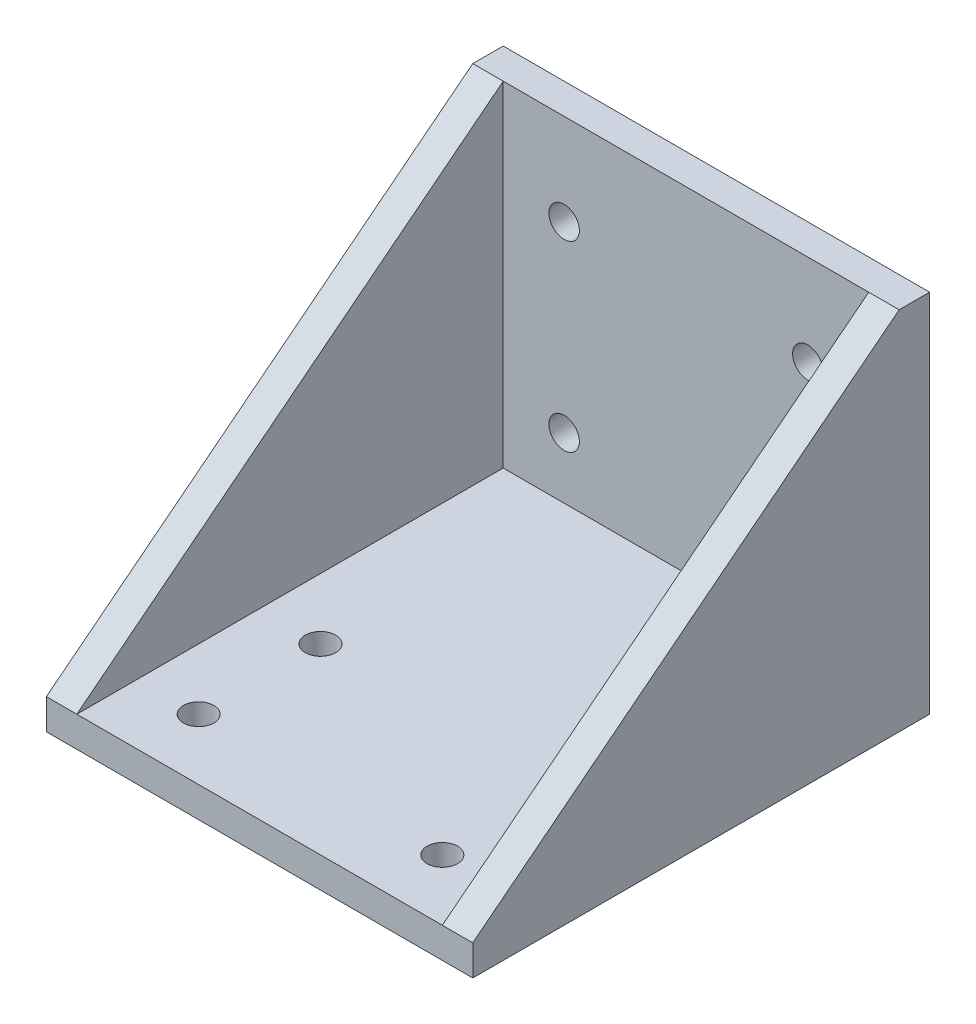
ISO-10303-21;
HEADER;
FILE_DESCRIPTION(('STEP AP214'),'2;1');
FILE_NAME('part.step','',(''),(''),'','','');
FILE_SCHEMA(('AUTOMOTIVE_DESIGN { 1 0 10303 214 1 1 1 1 }'));
ENDSEC;
DATA;
#1=APPLICATION_CONTEXT('core data for automotive mechanical design processes');
#2=APPLICATION_PROTOCOL_DEFINITION('international standard','automotive_design',2000,#1);
#3=PRODUCT_CONTEXT('',#1,'mechanical');
#4=PRODUCT('Part','Part','',(#3));
#5=PRODUCT_RELATED_PRODUCT_CATEGORY('part','',(#4));
#6=PRODUCT_DEFINITION_FORMATION('','',#4);
#7=PRODUCT_DEFINITION_CONTEXT('part definition',#1,'design');
#8=PRODUCT_DEFINITION('design','',#6,#7);
#9=PRODUCT_DEFINITION_SHAPE('','',#8);
#10=(LENGTH_UNIT() NAMED_UNIT(*) SI_UNIT(.MILLI.,.METRE.));
#11=(NAMED_UNIT(*) PLANE_ANGLE_UNIT() SI_UNIT($,.RADIAN.));
#12=(NAMED_UNIT(*) SI_UNIT($,.STERADIAN.) SOLID_ANGLE_UNIT());
#13=UNCERTAINTY_MEASURE_WITH_UNIT(LENGTH_MEASURE(1.E-05),#10,'distance_accuracy_value','');
#14=(GEOMETRIC_REPRESENTATION_CONTEXT(3) GLOBAL_UNCERTAINTY_ASSIGNED_CONTEXT((#13)) GLOBAL_UNIT_ASSIGNED_CONTEXT((#10,
#11,#12)) REPRESENTATION_CONTEXT('',''));
#15=CARTESIAN_POINT('',(0.,0.,0.));
#16=DIRECTION('',(0.,0.,1.));
#17=DIRECTION('',(1.,0.,0.));
#18=AXIS2_PLACEMENT_3D('',#15,#16,#17);
#19=CARTESIAN_POINT('',(0.,0.,5.));
#20=DIRECTION('',(0.,0.,-1.));
#21=DIRECTION('',(-1.,0.,0.));
#22=AXIS2_PLACEMENT_3D('',#19,#20,#21);
#23=PLANE('',#22);
#24=DIRECTION('',(-1.,0.,0.));
#25=VECTOR('',#24,1.);
#26=CARTESIAN_POINT('',(-35.,30.,5.));
#27=LINE('',#26,#25);
#28=CARTESIAN_POINT('',(30.,30.,5.));
#29=VERTEX_POINT('',#28);
#30=CARTESIAN_POINT('',(-30.,30.,5.));
#31=VERTEX_POINT('',#30);
#32=EDGE_CURVE('E126',#29,#31,#27,.T.);
#33=ORIENTED_EDGE('',*,*,#32,.T.);
#34=DIRECTION('',(0.,-1.,0.));
#35=VECTOR('',#34,1.);
#36=CARTESIAN_POINT('',(-30.,0.,5.));
#37=LINE('',#36,#35);
#38=CARTESIAN_POINT('',(-30.,-25.,5.));
#39=VERTEX_POINT('',#38);
#40=EDGE_CURVE('E64',#31,#39,#37,.T.);
#41=ORIENTED_EDGE('',*,*,#40,.T.);
#42=DIRECTION('',(1.,0.,0.));
#43=VECTOR('',#42,1.);
#44=CARTESIAN_POINT('',(0.,-25.,5.));
#45=LINE('',#44,#43);
#46=CARTESIAN_POINT('',(30.,-25.,5.));
#47=VERTEX_POINT('',#46);
#48=EDGE_CURVE('E180',#39,#47,#45,.T.);
#49=ORIENTED_EDGE('',*,*,#48,.T.);
#50=DIRECTION('',(0.,-1.,0.));
#51=VECTOR('',#50,1.);
#52=CARTESIAN_POINT('',(30.,0.,5.));
#53=LINE('',#52,#51);
#54=EDGE_CURVE('E182',#29,#47,#53,.T.);
#55=ORIENTED_EDGE('',*,*,#54,.F.);
#56=EDGE_LOOP('',(#33,#41,#49,#55));
#57=FACE_BOUND('',#56,.T.);
#58=CARTESIAN_POINT('',(-20.,15.,5.));
#59=DIRECTION('',(0.,0.,1.));
#60=DIRECTION('',(1.,0.,0.));
#61=AXIS2_PLACEMENT_3D('',#58,#59,#60);
#62=CIRCLE('',#61,2.5);
#63=CARTESIAN_POINT('',(-17.5,15.,5.));
#64=VERTEX_POINT('',#63);
#65=EDGE_CURVE('E147',#64,#64,#62,.T.);
#66=ORIENTED_EDGE('',*,*,#65,.F.);
#67=EDGE_LOOP('',(#66));
#68=FACE_BOUND('',#67,.T.);
#69=CARTESIAN_POINT('',(20.,15.,5.));
#70=DIRECTION('',(0.,0.,1.));
#71=DIRECTION('',(1.,0.,0.));
#72=AXIS2_PLACEMENT_3D('',#69,#70,#71);
#73=CIRCLE('',#72,2.5);
#74=CARTESIAN_POINT('',(22.5,15.,5.));
#75=VERTEX_POINT('',#74);
#76=EDGE_CURVE('E152',#75,#75,#73,.T.);
#77=ORIENTED_EDGE('',*,*,#76,.F.);
#78=EDGE_LOOP('',(#77));
#79=FACE_BOUND('',#78,.T.);
#80=CARTESIAN_POINT('',(-20.,-15.,5.));
#81=DIRECTION('',(0.,0.,1.));
#82=DIRECTION('',(1.,0.,0.));
#83=AXIS2_PLACEMENT_3D('',#80,#81,#82);
#84=CIRCLE('',#83,2.5);
#85=CARTESIAN_POINT('',(-17.5,-15.,5.));
#86=VERTEX_POINT('',#85);
#87=EDGE_CURVE('E158',#86,#86,#84,.T.);
#88=ORIENTED_EDGE('',*,*,#87,.F.);
#89=EDGE_LOOP('',(#88));
#90=FACE_BOUND('',#89,.T.);
#91=CARTESIAN_POINT('',(20.,-15.,5.));
#92=DIRECTION('',(0.,0.,1.));
#93=DIRECTION('',(1.,0.,0.));
#94=AXIS2_PLACEMENT_3D('',#91,#92,#93);
#95=CIRCLE('',#94,2.5);
#96=CARTESIAN_POINT('',(22.5,-15.,5.));
#97=VERTEX_POINT('',#96);
#98=EDGE_CURVE('E164',#97,#97,#95,.T.);
#99=ORIENTED_EDGE('',*,*,#98,.F.);
#100=EDGE_LOOP('',(#99));
#101=FACE_BOUND('',#100,.T.);
#102=ADVANCED_FACE('F42',(#57,#68,#79,#90,#101),#23,.F.);
#103=CARTESIAN_POINT('',(0.,0.,0.));
#104=DIRECTION('',(0.,0.,-1.));
#105=DIRECTION('',(-1.,0.,0.));
#106=AXIS2_PLACEMENT_3D('',#103,#104,#105);
#107=PLANE('',#106);
#108=CARTESIAN_POINT('',(-20.,-15.,0.));
#109=DIRECTION('',(0.,0.,1.));
#110=DIRECTION('',(1.,0.,0.));
#111=AXIS2_PLACEMENT_3D('',#108,#109,#110);
#112=CIRCLE('',#111,2.5);
#113=CARTESIAN_POINT('',(-17.5,-15.,0.));
#114=VERTEX_POINT('',#113);
#115=EDGE_CURVE('E161',#114,#114,#112,.T.);
#116=ORIENTED_EDGE('',*,*,#115,.T.);
#117=EDGE_LOOP('',(#116));
#118=FACE_BOUND('',#117,.T.);
#119=CARTESIAN_POINT('',(-20.,15.,0.));
#120=DIRECTION('',(0.,0.,1.));
#121=DIRECTION('',(1.,0.,0.));
#122=AXIS2_PLACEMENT_3D('',#119,#120,#121);
#123=CIRCLE('',#122,2.5);
#124=CARTESIAN_POINT('',(-17.5,15.,0.));
#125=VERTEX_POINT('',#124);
#126=EDGE_CURVE('E149',#125,#125,#123,.T.);
#127=ORIENTED_EDGE('',*,*,#126,.T.);
#128=EDGE_LOOP('',(#127));
#129=FACE_BOUND('',#128,.T.);
#130=DIRECTION('',(0.,1.,0.));
#131=VECTOR('',#130,1.);
#132=CARTESIAN_POINT('',(35.,-30.,0.));
#133=LINE('',#132,#131);
#134=CARTESIAN_POINT('',(35.,-30.,0.));
#135=VERTEX_POINT('',#134);
#136=CARTESIAN_POINT('',(35.,30.,0.));
#137=VERTEX_POINT('',#136);
#138=EDGE_CURVE('E131',#135,#137,#133,.T.);
#139=ORIENTED_EDGE('',*,*,#138,.F.);
#140=DIRECTION('',(1.,0.,0.));
#141=VECTOR('',#140,1.);
#142=CARTESIAN_POINT('',(-35.,-30.,0.));
#143=LINE('',#142,#141);
#144=CARTESIAN_POINT('',(-35.,-30.,0.));
#145=VERTEX_POINT('',#144);
#146=EDGE_CURVE('E140',#145,#135,#143,.T.);
#147=ORIENTED_EDGE('',*,*,#146,.F.);
#148=DIRECTION('',(0.,-1.,0.));
#149=VECTOR('',#148,1.);
#150=CARTESIAN_POINT('',(-35.,-30.,0.));
#151=LINE('',#150,#149);
#152=CARTESIAN_POINT('',(-35.,30.,0.));
#153=VERTEX_POINT('',#152);
#154=EDGE_CURVE('E142',#153,#145,#151,.T.);
#155=ORIENTED_EDGE('',*,*,#154,.F.);
#156=DIRECTION('',(-1.,0.,0.));
#157=VECTOR('',#156,1.);
#158=CARTESIAN_POINT('',(-35.,30.,0.));
#159=LINE('',#158,#157);
#160=EDGE_CURVE('E144',#137,#153,#159,.T.);
#161=ORIENTED_EDGE('',*,*,#160,.F.);
#162=EDGE_LOOP('',(#139,#147,#155,#161));
#163=FACE_BOUND('',#162,.T.);
#164=CARTESIAN_POINT('',(20.,15.,0.));
#165=DIRECTION('',(0.,0.,1.));
#166=DIRECTION('',(1.,0.,0.));
#167=AXIS2_PLACEMENT_3D('',#164,#165,#166);
#168=CIRCLE('',#167,2.5);
#169=CARTESIAN_POINT('',(22.5,15.,0.));
#170=VERTEX_POINT('',#169);
#171=EDGE_CURVE('E155',#170,#170,#168,.T.);
#172=ORIENTED_EDGE('',*,*,#171,.T.);
#173=EDGE_LOOP('',(#172));
#174=FACE_BOUND('',#173,.T.);
#175=CARTESIAN_POINT('',(20.,-15.,0.));
#176=DIRECTION('',(0.,0.,1.));
#177=DIRECTION('',(1.,0.,0.));
#178=AXIS2_PLACEMENT_3D('',#175,#176,#177);
#179=CIRCLE('',#178,2.5);
#180=CARTESIAN_POINT('',(22.5,-15.,0.));
#181=VERTEX_POINT('',#180);
#182=EDGE_CURVE('E167',#181,#181,#179,.T.);
#183=ORIENTED_EDGE('',*,*,#182,.T.);
#184=EDGE_LOOP('',(#183));
#185=FACE_BOUND('',#184,.T.);
#186=ADVANCED_FACE('F249',(#118,#129,#163,#174,#185),#107,.T.);
#187=CARTESIAN_POINT('',(35.,-30.,5.));
#188=DIRECTION('',(-1.,0.,0.));
#189=DIRECTION('',(0.,0.,1.));
#190=AXIS2_PLACEMENT_3D('',#187,#188,#189);
#191=PLANE('',#190);
#192=DIRECTION('',(0.,0.,-1.));
#193=VECTOR('',#192,1.);
#194=CARTESIAN_POINT('',(35.,30.,5.));
#195=LINE('',#194,#193);
#196=CARTESIAN_POINT('',(35.,30.,5.));
#197=VERTEX_POINT('',#196);
#198=EDGE_CURVE('E50',#197,#137,#195,.T.);
#199=ORIENTED_EDGE('',*,*,#198,.F.);
#200=DIRECTION('',(0.,-0.617821551931903,0.786318338822423));
#201=VECTOR('',#200,1.);
#202=CARTESIAN_POINT('',(35.,30.,5.));
#203=LINE('',#202,#201);
#204=CARTESIAN_POINT('',(35.,-25.,75.));
#205=VERTEX_POINT('',#204);
#206=EDGE_CURVE('E106',#197,#205,#203,.T.);
#207=ORIENTED_EDGE('',*,*,#206,.T.);
#208=DIRECTION('',(0.,1.,0.));
#209=VECTOR('',#208,1.);
#210=CARTESIAN_POINT('',(35.,0.,75.));
#211=LINE('',#210,#209);
#212=CARTESIAN_POINT('',(35.,-30.,75.));
#213=VERTEX_POINT('',#212);
#214=EDGE_CURVE('E177',#213,#205,#211,.T.);
#215=ORIENTED_EDGE('',*,*,#214,.F.);
#216=DIRECTION('',(0.,0.,-1.));
#217=VECTOR('',#216,1.);
#218=CARTESIAN_POINT('',(35.,-30.,5.));
#219=LINE('',#218,#217);
#220=EDGE_CURVE('E138',#213,#135,#219,.T.);
#221=ORIENTED_EDGE('',*,*,#220,.T.);
#222=ORIENTED_EDGE('',*,*,#138,.T.);
#223=EDGE_LOOP('',(#199,#207,#215,#221,#222));
#224=FACE_BOUND('',#223,.T.);
#225=ADVANCED_FACE('F44',(#224),#191,.F.);
#226=CARTESIAN_POINT('',(-35.,30.,5.));
#227=DIRECTION('',(0.,-1.,0.));
#228=DIRECTION('',(0.,0.,-1.));
#229=AXIS2_PLACEMENT_3D('',#226,#227,#228);
#230=PLANE('',#229);
#231=DIRECTION('',(0.,0.,-1.));
#232=VECTOR('',#231,1.);
#233=CARTESIAN_POINT('',(-35.,30.,5.));
#234=LINE('',#233,#232);
#235=CARTESIAN_POINT('',(-35.,30.,5.));
#236=VERTEX_POINT('',#235);
#237=EDGE_CURVE('E132',#236,#153,#234,.T.);
#238=ORIENTED_EDGE('',*,*,#237,.F.);
#239=DIRECTION('',(-1.,0.,0.));
#240=VECTOR('',#239,1.);
#241=CARTESIAN_POINT('',(35.,30.,5.));
#242=LINE('',#241,#240);
#243=EDGE_CURVE('E117',#31,#236,#242,.T.);
#244=ORIENTED_EDGE('',*,*,#243,.F.);
#245=ORIENTED_EDGE('',*,*,#32,.F.);
#246=EDGE_CURVE('E109',#197,#29,#242,.T.);
#247=ORIENTED_EDGE('',*,*,#246,.F.);
#248=ORIENTED_EDGE('',*,*,#198,.T.);
#249=ORIENTED_EDGE('',*,*,#160,.T.);
#250=EDGE_LOOP('',(#238,#244,#245,#247,#248,#249));
#251=FACE_BOUND('',#250,.T.);
#252=ADVANCED_FACE('F122',(#251),#230,.F.);
#253=CARTESIAN_POINT('',(-35.,-30.,5.));
#254=DIRECTION('',(1.,0.,0.));
#255=DIRECTION('',(0.,0.,-1.));
#256=AXIS2_PLACEMENT_3D('',#253,#254,#255);
#257=PLANE('',#256);
#258=DIRECTION('',(0.,-1.,0.));
#259=VECTOR('',#258,1.);
#260=CARTESIAN_POINT('',(-35.,0.,75.));
#261=LINE('',#260,#259);
#262=CARTESIAN_POINT('',(-35.,-25.,75.));
#263=VERTEX_POINT('',#262);
#264=CARTESIAN_POINT('',(-35.,-30.,75.));
#265=VERTEX_POINT('',#264);
#266=EDGE_CURVE('E190',#263,#265,#261,.T.);
#267=ORIENTED_EDGE('',*,*,#266,.F.);
#268=DIRECTION('',(0.,-0.617821551931903,0.786318338822423));
#269=VECTOR('',#268,1.);
#270=CARTESIAN_POINT('',(-35.,30.,5.));
#271=LINE('',#270,#269);
#272=EDGE_CURVE('E56',#236,#263,#271,.T.);
#273=ORIENTED_EDGE('',*,*,#272,.F.);
#274=ORIENTED_EDGE('',*,*,#237,.T.);
#275=ORIENTED_EDGE('',*,*,#154,.T.);
#276=DIRECTION('',(0.,0.,-1.));
#277=VECTOR('',#276,1.);
#278=CARTESIAN_POINT('',(-35.,-30.,5.));
#279=LINE('',#278,#277);
#280=EDGE_CURVE('E133',#265,#145,#279,.T.);
#281=ORIENTED_EDGE('',*,*,#280,.F.);
#282=EDGE_LOOP('',(#267,#273,#274,#275,#281));
#283=FACE_BOUND('',#282,.T.);
#284=ADVANCED_FACE('F239',(#283),#257,.F.);
#285=CARTESIAN_POINT('',(-35.,-30.,5.));
#286=DIRECTION('',(0.,1.,0.));
#287=DIRECTION('',(0.,0.,1.));
#288=AXIS2_PLACEMENT_3D('',#285,#286,#287);
#289=PLANE('',#288);
#290=CARTESIAN_POINT('',(20.,-30.,65.));
#291=DIRECTION('',(0.,-1.,0.));
#292=DIRECTION('',(0.,0.,-1.));
#293=AXIS2_PLACEMENT_3D('',#290,#291,#292);
#294=CIRCLE('',#293,2.5);
#295=CARTESIAN_POINT('',(20.,-30.,62.5));
#296=VERTEX_POINT('',#295);
#297=EDGE_CURVE('E213',#296,#296,#294,.T.);
#298=ORIENTED_EDGE('',*,*,#297,.F.);
#299=EDGE_LOOP('',(#298));
#300=FACE_BOUND('',#299,.T.);
#301=CARTESIAN_POINT('',(-20.,-30.,45.));
#302=DIRECTION('',(0.,-1.,0.));
#303=DIRECTION('',(0.,0.,-1.));
#304=AXIS2_PLACEMENT_3D('',#301,#302,#303);
#305=CIRCLE('',#304,2.5);
#306=CARTESIAN_POINT('',(-20.,-30.,42.5));
#307=VERTEX_POINT('',#306);
#308=EDGE_CURVE('E206',#307,#307,#305,.T.);
#309=ORIENTED_EDGE('',*,*,#308,.F.);
#310=EDGE_LOOP('',(#309));
#311=FACE_BOUND('',#310,.T.);
#312=CARTESIAN_POINT('',(20.,-30.,45.));
#313=DIRECTION('',(0.,-1.,0.));
#314=DIRECTION('',(0.,0.,-1.));
#315=AXIS2_PLACEMENT_3D('',#312,#313,#314);
#316=CIRCLE('',#315,2.5);
#317=CARTESIAN_POINT('',(20.,-30.,42.5));
#318=VERTEX_POINT('',#317);
#319=EDGE_CURVE('E218',#318,#318,#316,.T.);
#320=ORIENTED_EDGE('',*,*,#319,.F.);
#321=EDGE_LOOP('',(#320));
#322=FACE_BOUND('',#321,.T.);
#323=CARTESIAN_POINT('',(-20.,-30.,65.));
#324=DIRECTION('',(0.,-1.,0.));
#325=DIRECTION('',(0.,0.,-1.));
#326=AXIS2_PLACEMENT_3D('',#323,#324,#325);
#327=CIRCLE('',#326,2.5);
#328=CARTESIAN_POINT('',(-20.,-30.,62.5));
#329=VERTEX_POINT('',#328);
#330=EDGE_CURVE('E200',#329,#329,#327,.T.);
#331=ORIENTED_EDGE('',*,*,#330,.F.);
#332=EDGE_LOOP('',(#331));
#333=FACE_BOUND('',#332,.T.);
#334=ORIENTED_EDGE('',*,*,#146,.T.);
#335=ORIENTED_EDGE('',*,*,#220,.F.);
#336=DIRECTION('',(1.,0.,0.));
#337=VECTOR('',#336,1.);
#338=CARTESIAN_POINT('',(0.,-30.,75.));
#339=LINE('',#338,#337);
#340=EDGE_CURVE('E187',#265,#213,#339,.T.);
#341=ORIENTED_EDGE('',*,*,#340,.F.);
#342=ORIENTED_EDGE('',*,*,#280,.T.);
#343=EDGE_LOOP('',(#334,#335,#341,#342));
#344=FACE_BOUND('',#343,.T.);
#345=ADVANCED_FACE('F235',(#300,#311,#322,#333,#344),#289,.F.);
#346=CARTESIAN_POINT('',(-20.,15.,5.));
#347=DIRECTION('',(0.,0.,-1.));
#348=DIRECTION('',(-1.,0.,0.));
#349=AXIS2_PLACEMENT_3D('',#346,#347,#348);
#350=CYLINDRICAL_SURFACE('',#349,2.5);
#351=ORIENTED_EDGE('',*,*,#65,.T.);
#352=EDGE_LOOP('',(#351));
#353=FACE_BOUND('',#352,.T.);
#354=ORIENTED_EDGE('',*,*,#126,.F.);
#355=EDGE_LOOP('',(#354));
#356=FACE_BOUND('',#355,.T.);
#357=ADVANCED_FACE('F238',(#353,#356),#350,.F.);
#358=CARTESIAN_POINT('',(20.,15.,5.));
#359=DIRECTION('',(0.,0.,-1.));
#360=DIRECTION('',(-1.,0.,0.));
#361=AXIS2_PLACEMENT_3D('',#358,#359,#360);
#362=CYLINDRICAL_SURFACE('',#361,2.5);
#363=ORIENTED_EDGE('',*,*,#76,.T.);
#364=EDGE_LOOP('',(#363));
#365=FACE_BOUND('',#364,.T.);
#366=ORIENTED_EDGE('',*,*,#171,.F.);
#367=EDGE_LOOP('',(#366));
#368=FACE_BOUND('',#367,.T.);
#369=ADVANCED_FACE('F312',(#365,#368),#362,.F.);
#370=CARTESIAN_POINT('',(-20.,-15.,5.));
#371=DIRECTION('',(0.,0.,-1.));
#372=DIRECTION('',(-1.,0.,0.));
#373=AXIS2_PLACEMENT_3D('',#370,#371,#372);
#374=CYLINDRICAL_SURFACE('',#373,2.5);
#375=ORIENTED_EDGE('',*,*,#87,.T.);
#376=EDGE_LOOP('',(#375));
#377=FACE_BOUND('',#376,.T.);
#378=ORIENTED_EDGE('',*,*,#115,.F.);
#379=EDGE_LOOP('',(#378));
#380=FACE_BOUND('',#379,.T.);
#381=ADVANCED_FACE('F277',(#377,#380),#374,.F.);
#382=CARTESIAN_POINT('',(20.,-15.,5.));
#383=DIRECTION('',(0.,0.,-1.));
#384=DIRECTION('',(-1.,0.,0.));
#385=AXIS2_PLACEMENT_3D('',#382,#383,#384);
#386=CYLINDRICAL_SURFACE('',#385,2.5);
#387=ORIENTED_EDGE('',*,*,#98,.T.);
#388=EDGE_LOOP('',(#387));
#389=FACE_BOUND('',#388,.T.);
#390=ORIENTED_EDGE('',*,*,#182,.F.);
#391=EDGE_LOOP('',(#390));
#392=FACE_BOUND('',#391,.T.);
#393=ADVANCED_FACE('F269',(#389,#392),#386,.F.);
#394=CARTESIAN_POINT('',(30.,0.,75.));
#395=DIRECTION('',(1.,0.,0.));
#396=DIRECTION('',(0.,1.,0.));
#397=AXIS2_PLACEMENT_3D('',#394,#395,#396);
#398=PLANE('',#397);
#399=DIRECTION('',(0.,0.,-1.));
#400=VECTOR('',#399,1.);
#401=CARTESIAN_POINT('',(30.,-25.,75.));
#402=LINE('',#401,#400);
#403=CARTESIAN_POINT('',(30.,-25.,75.));
#404=VERTEX_POINT('',#403);
#405=EDGE_CURVE('E170',#404,#47,#402,.T.);
#406=ORIENTED_EDGE('',*,*,#405,.F.);
#407=DIRECTION('',(0.,0.617821551931903,-0.786318338822423));
#408=VECTOR('',#407,1.);
#409=CARTESIAN_POINT('',(30.,-15.4574132492114,62.8548895899054));
#410=LINE('',#409,#408);
#411=EDGE_CURVE('E185',#404,#29,#410,.T.);
#412=ORIENTED_EDGE('',*,*,#411,.T.);
#413=ORIENTED_EDGE('',*,*,#54,.T.);
#414=EDGE_LOOP('',(#406,#412,#413));
#415=FACE_BOUND('',#414,.T.);
#416=ADVANCED_FACE('F267',(#415),#398,.F.);
#417=CARTESIAN_POINT('',(0.,-25.,75.));
#418=DIRECTION('',(0.,1.,0.));
#419=DIRECTION('',(0.,0.,1.));
#420=AXIS2_PLACEMENT_3D('',#417,#418,#419);
#421=PLANE('',#420);
#422=CARTESIAN_POINT('',(20.,-25.,65.));
#423=DIRECTION('',(0.,-1.,0.));
#424=DIRECTION('',(0.,0.,-1.));
#425=AXIS2_PLACEMENT_3D('',#422,#423,#424);
#426=CIRCLE('',#425,2.5);
#427=CARTESIAN_POINT('',(20.,-25.,62.5));
#428=VERTEX_POINT('',#427);
#429=EDGE_CURVE('E203',#428,#428,#426,.T.);
#430=ORIENTED_EDGE('',*,*,#429,.T.);
#431=EDGE_LOOP('',(#430));
#432=FACE_BOUND('',#431,.T.);
#433=CARTESIAN_POINT('',(-20.,-25.,45.));
#434=DIRECTION('',(0.,-1.,0.));
#435=DIRECTION('',(0.,0.,-1.));
#436=AXIS2_PLACEMENT_3D('',#433,#434,#435);
#437=CIRCLE('',#436,2.5);
#438=CARTESIAN_POINT('',(-20.,-25.,42.5));
#439=VERTEX_POINT('',#438);
#440=EDGE_CURVE('E209',#439,#439,#437,.T.);
#441=ORIENTED_EDGE('',*,*,#440,.T.);
#442=EDGE_LOOP('',(#441));
#443=FACE_BOUND('',#442,.T.);
#444=CARTESIAN_POINT('',(20.,-25.,45.));
#445=DIRECTION('',(0.,-1.,0.));
#446=DIRECTION('',(0.,0.,-1.));
#447=AXIS2_PLACEMENT_3D('',#444,#445,#446);
#448=CIRCLE('',#447,2.5);
#449=CARTESIAN_POINT('',(20.,-25.,42.5));
#450=VERTEX_POINT('',#449);
#451=EDGE_CURVE('E210',#450,#450,#448,.T.);
#452=ORIENTED_EDGE('',*,*,#451,.T.);
#453=EDGE_LOOP('',(#452));
#454=FACE_BOUND('',#453,.T.);
#455=CARTESIAN_POINT('',(-20.,-25.,65.));
#456=DIRECTION('',(0.,-1.,0.));
#457=DIRECTION('',(0.,0.,-1.));
#458=AXIS2_PLACEMENT_3D('',#455,#456,#457);
#459=CIRCLE('',#458,2.5);
#460=CARTESIAN_POINT('',(-20.,-25.,62.5));
#461=VERTEX_POINT('',#460);
#462=EDGE_CURVE('E198',#461,#461,#459,.T.);
#463=ORIENTED_EDGE('',*,*,#462,.T.);
#464=EDGE_LOOP('',(#463));
#465=FACE_BOUND('',#464,.T.);
#466=ORIENTED_EDGE('',*,*,#48,.F.);
#467=DIRECTION('',(0.,0.,-1.));
#468=VECTOR('',#467,1.);
#469=CARTESIAN_POINT('',(-30.,-25.,75.));
#470=LINE('',#469,#468);
#471=CARTESIAN_POINT('',(-30.,-25.,75.));
#472=VERTEX_POINT('',#471);
#473=EDGE_CURVE('E175',#472,#39,#470,.T.);
#474=ORIENTED_EDGE('',*,*,#473,.F.);
#475=DIRECTION('',(1.,0.,0.));
#476=VECTOR('',#475,1.);
#477=CARTESIAN_POINT('',(0.,-25.,75.));
#478=LINE('',#477,#476);
#479=EDGE_CURVE('E179',#472,#404,#478,.T.);
#480=ORIENTED_EDGE('',*,*,#479,.T.);
#481=ORIENTED_EDGE('',*,*,#405,.T.);
#482=EDGE_LOOP('',(#466,#474,#480,#481));
#483=FACE_BOUND('',#482,.T.);
#484=ADVANCED_FACE('F224',(#432,#443,#454,#465,#483),#421,.T.);
#485=CARTESIAN_POINT('',(-30.,0.,75.));
#486=DIRECTION('',(1.,0.,0.));
#487=DIRECTION('',(0.,1.,0.));
#488=AXIS2_PLACEMENT_3D('',#485,#486,#487);
#489=PLANE('',#488);
#490=DIRECTION('',(0.,0.617821551931903,-0.786318338822423));
#491=VECTOR('',#490,1.);
#492=CARTESIAN_POINT('',(-30.,-15.4574132492114,62.8548895899054));
#493=LINE('',#492,#491);
#494=EDGE_CURVE('E195',#472,#31,#493,.T.);
#495=ORIENTED_EDGE('',*,*,#494,.F.);
#496=ORIENTED_EDGE('',*,*,#473,.T.);
#497=ORIENTED_EDGE('',*,*,#40,.F.);
#498=EDGE_LOOP('',(#495,#496,#497));
#499=FACE_BOUND('',#498,.T.);
#500=ADVANCED_FACE('F260',(#499),#489,.T.);
#501=CARTESIAN_POINT('',(0.,0.,75.));
#502=DIRECTION('',(0.,0.,1.));
#503=DIRECTION('',(1.,0.,0.));
#504=AXIS2_PLACEMENT_3D('',#501,#502,#503);
#505=PLANE('',#504);
#506=DIRECTION('',(1.,0.,0.));
#507=VECTOR('',#506,1.);
#508=CARTESIAN_POINT('',(0.,-25.,75.));
#509=LINE('',#508,#507);
#510=EDGE_CURVE('E11',#263,#472,#509,.T.);
#511=ORIENTED_EDGE('',*,*,#510,.F.);
#512=ORIENTED_EDGE('',*,*,#266,.T.);
#513=ORIENTED_EDGE('',*,*,#340,.T.);
#514=ORIENTED_EDGE('',*,*,#214,.T.);
#515=DIRECTION('',(-1.,0.,0.));
#516=VECTOR('',#515,1.);
#517=CARTESIAN_POINT('',(35.,-25.,75.));
#518=LINE('',#517,#516);
#519=EDGE_CURVE('E112',#205,#404,#518,.T.);
#520=ORIENTED_EDGE('',*,*,#519,.T.);
#521=ORIENTED_EDGE('',*,*,#479,.F.);
#522=EDGE_LOOP('',(#511,#512,#513,#514,#520,#521));
#523=FACE_BOUND('',#522,.T.);
#524=ADVANCED_FACE('F254',(#523),#505,.T.);
#525=CARTESIAN_POINT('',(35.,30.,5.));
#526=DIRECTION('',(0.,-0.786318338822423,-0.617821551931903));
#527=DIRECTION('',(0.,0.617821551931903,-0.786318338822423));
#528=AXIS2_PLACEMENT_3D('',#525,#526,#527);
#529=PLANE('',#528);
#530=ORIENTED_EDGE('',*,*,#519,.F.);
#531=ORIENTED_EDGE('',*,*,#206,.F.);
#532=ORIENTED_EDGE('',*,*,#246,.T.);
#533=ORIENTED_EDGE('',*,*,#411,.F.);
#534=EDGE_LOOP('',(#530,#531,#532,#533));
#535=FACE_BOUND('',#534,.T.);
#536=ADVANCED_FACE('F108',(#535),#529,.F.);
#537=ORIENTED_EDGE('',*,*,#494,.T.);
#538=ORIENTED_EDGE('',*,*,#243,.T.);
#539=ORIENTED_EDGE('',*,*,#272,.T.);
#540=ORIENTED_EDGE('',*,*,#510,.T.);
#541=EDGE_LOOP('',(#537,#538,#539,#540));
#542=FACE_BOUND('',#541,.T.);
#543=ADVANCED_FACE('F257',(#542),#529,.F.);
#544=CARTESIAN_POINT('',(-20.,-25.,65.));
#545=DIRECTION('',(0.,-1.,0.));
#546=DIRECTION('',(0.,0.,-1.));
#547=AXIS2_PLACEMENT_3D('',#544,#545,#546);
#548=CYLINDRICAL_SURFACE('',#547,2.5);
#549=ORIENTED_EDGE('',*,*,#462,.F.);
#550=EDGE_LOOP('',(#549));
#551=FACE_BOUND('',#550,.T.);
#552=ORIENTED_EDGE('',*,*,#330,.T.);
#553=EDGE_LOOP('',(#552));
#554=FACE_BOUND('',#553,.T.);
#555=ADVANCED_FACE('F231',(#551,#554),#548,.F.);
#556=CARTESIAN_POINT('',(20.,-25.,45.));
#557=DIRECTION('',(0.,-1.,0.));
#558=DIRECTION('',(0.,0.,-1.));
#559=AXIS2_PLACEMENT_3D('',#556,#557,#558);
#560=CYLINDRICAL_SURFACE('',#559,2.5);
#561=ORIENTED_EDGE('',*,*,#451,.F.);
#562=EDGE_LOOP('',(#561));
#563=FACE_BOUND('',#562,.T.);
#564=ORIENTED_EDGE('',*,*,#319,.T.);
#565=EDGE_LOOP('',(#564));
#566=FACE_BOUND('',#565,.T.);
#567=ADVANCED_FACE('F227',(#563,#566),#560,.F.);
#568=CARTESIAN_POINT('',(-20.,-25.,45.));
#569=DIRECTION('',(0.,-1.,0.));
#570=DIRECTION('',(0.,0.,-1.));
#571=AXIS2_PLACEMENT_3D('',#568,#569,#570);
#572=CYLINDRICAL_SURFACE('',#571,2.5);
#573=ORIENTED_EDGE('',*,*,#440,.F.);
#574=EDGE_LOOP('',(#573));
#575=FACE_BOUND('',#574,.T.);
#576=ORIENTED_EDGE('',*,*,#308,.T.);
#577=EDGE_LOOP('',(#576));
#578=FACE_BOUND('',#577,.T.);
#579=ADVANCED_FACE('F230',(#575,#578),#572,.F.);
#580=CARTESIAN_POINT('',(20.,-25.,65.));
#581=DIRECTION('',(0.,-1.,0.));
#582=DIRECTION('',(0.,0.,-1.));
#583=AXIS2_PLACEMENT_3D('',#580,#581,#582);
#584=CYLINDRICAL_SURFACE('',#583,2.5);
#585=ORIENTED_EDGE('',*,*,#429,.F.);
#586=EDGE_LOOP('',(#585));
#587=FACE_BOUND('',#586,.T.);
#588=ORIENTED_EDGE('',*,*,#297,.T.);
#589=EDGE_LOOP('',(#588));
#590=FACE_BOUND('',#589,.T.);
#591=ADVANCED_FACE('F442',(#587,#590),#584,.F.);
#592=CLOSED_SHELL('',(#102,#186,#225,#252,#284,#345,#357,#369,#381,#393,#416,#484,#500,#524,
#536,#543,#555,#567,#579,#591));
#593=MANIFOLD_SOLID_BREP('B2',#592);
#594=ADVANCED_BREP_SHAPE_REPRESENTATION('',(#18,#593),#14);
#595=SHAPE_DEFINITION_REPRESENTATION(#9,#594);
ENDSEC;
END-ISO-10303-21;
